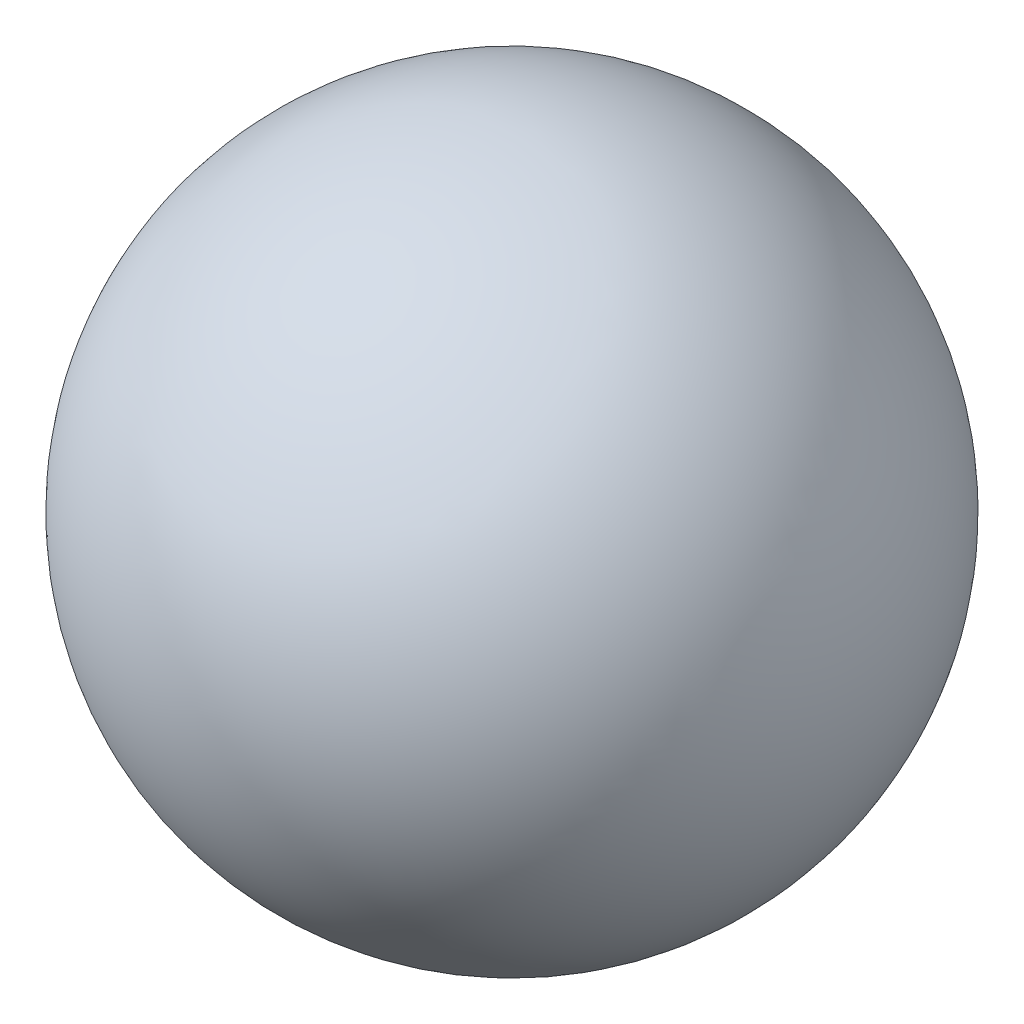
ISO-10303-21;
HEADER;
FILE_DESCRIPTION(('STEP AP214'),'2;1');
FILE_NAME('part.step','',(''),(''),'','','');
FILE_SCHEMA(('AUTOMOTIVE_DESIGN { 1 0 10303 214 1 1 1 1 }'));
ENDSEC;
DATA;
#1=APPLICATION_CONTEXT('core data for automotive mechanical design processes');
#2=APPLICATION_PROTOCOL_DEFINITION('international standard','automotive_design',2000,#1);
#3=PRODUCT_CONTEXT('',#1,'mechanical');
#4=PRODUCT('Part','Part','',(#3));
#5=PRODUCT_RELATED_PRODUCT_CATEGORY('part','',(#4));
#6=PRODUCT_DEFINITION_FORMATION('','',#4);
#7=PRODUCT_DEFINITION_CONTEXT('part definition',#1,'design');
#8=PRODUCT_DEFINITION('design','',#6,#7);
#9=PRODUCT_DEFINITION_SHAPE('','',#8);
#10=(LENGTH_UNIT() NAMED_UNIT(*) SI_UNIT(.MILLI.,.METRE.));
#11=(NAMED_UNIT(*) PLANE_ANGLE_UNIT() SI_UNIT($,.RADIAN.));
#12=(NAMED_UNIT(*) SI_UNIT($,.STERADIAN.) SOLID_ANGLE_UNIT());
#13=UNCERTAINTY_MEASURE_WITH_UNIT(LENGTH_MEASURE(1.E-05),#10,'distance_accuracy_value','');
#14=(GEOMETRIC_REPRESENTATION_CONTEXT(3) GLOBAL_UNCERTAINTY_ASSIGNED_CONTEXT((#13)) GLOBAL_UNIT_ASSIGNED_CONTEXT((#10,
#11,#12)) REPRESENTATION_CONTEXT('',''));
#15=CARTESIAN_POINT('',(0.,0.,0.));
#16=DIRECTION('',(0.,0.,1.));
#17=DIRECTION('',(1.,0.,0.));
#18=AXIS2_PLACEMENT_3D('',#15,#16,#17);
#19=CARTESIAN_POINT('',(0.,0.,0.));
#20=DIRECTION('',(-1.,0.,0.));
#21=DIRECTION('',(0.,1.,0.));
#22=AXIS2_PLACEMENT_3D('',#19,#20,#21);
#23=SPHERICAL_SURFACE('',#22,14.54);
#24=CARTESIAN_POINT('',(-14.54,0.,0.));
#25=VERTEX_POINT('',#24);
#26=VERTEX_LOOP('',#25);
#27=FACE_BOUND('',#26,.T.);
#28=ADVANCED_FACE('F31',(#27),#23,.T.);
#29=CLOSED_SHELL('',(#28));
#30=CARTESIAN_POINT('',(0.,0.,0.));
#31=DIRECTION('',(-1.,0.,0.));
#32=DIRECTION('',(0.,1.,0.));
#33=AXIS2_PLACEMENT_3D('',#30,#31,#32);
#34=SPHERICAL_SURFACE('',#33,12.);
#35=CARTESIAN_POINT('',(-12.,0.,0.));
#36=VERTEX_POINT('',#35);
#37=VERTEX_LOOP('',#36);
#38=FACE_BOUND('',#37,.T.);
#39=ADVANCED_FACE('F43',(#38),#34,.F.);
#40=CLOSED_SHELL('',(#39));
#41=ORIENTED_CLOSED_SHELL('',*,#40,.T.);
#42=BREP_WITH_VOIDS('B2',#29,(#41));
#43=ADVANCED_BREP_SHAPE_REPRESENTATION('',(#18,#42),#14);
#44=SHAPE_DEFINITION_REPRESENTATION(#9,#43);
ENDSEC;
END-ISO-10303-21;
